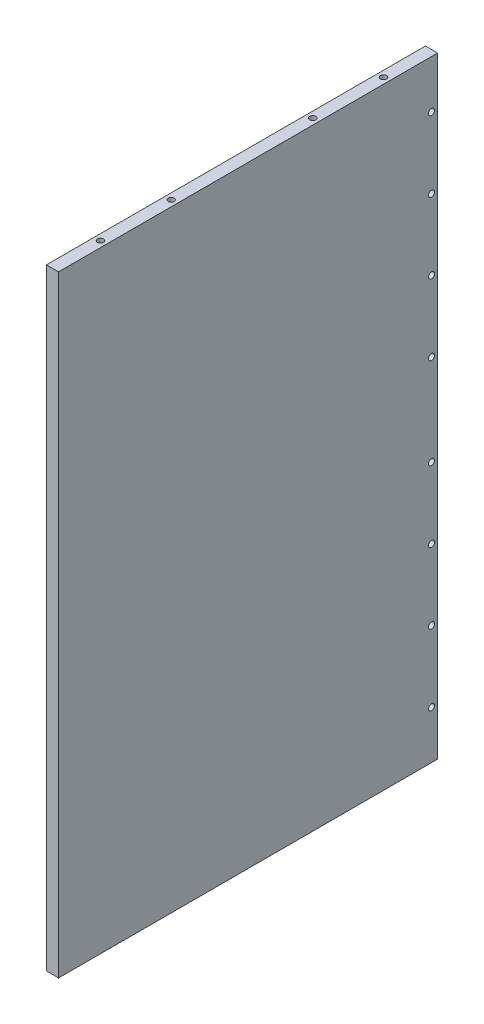
ISO-10303-21;
HEADER;
FILE_DESCRIPTION(('STEP AP214'),'2;1');
FILE_NAME('part.step','',(''),(''),'','','');
FILE_SCHEMA(('AUTOMOTIVE_DESIGN { 1 0 10303 214 1 1 1 1 }'));
ENDSEC;
DATA;
#1=APPLICATION_CONTEXT('core data for automotive mechanical design processes');
#2=APPLICATION_PROTOCOL_DEFINITION('international standard','automotive_design',2000,#1);
#3=PRODUCT_CONTEXT('',#1,'mechanical');
#4=PRODUCT('Part','Part','',(#3));
#5=PRODUCT_RELATED_PRODUCT_CATEGORY('part','',(#4));
#6=PRODUCT_DEFINITION_FORMATION('','',#4);
#7=PRODUCT_DEFINITION_CONTEXT('part definition',#1,'design');
#8=PRODUCT_DEFINITION('design','',#6,#7);
#9=PRODUCT_DEFINITION_SHAPE('','',#8);
#10=(LENGTH_UNIT() NAMED_UNIT(*) SI_UNIT(.MILLI.,.METRE.));
#11=(NAMED_UNIT(*) PLANE_ANGLE_UNIT() SI_UNIT($,.RADIAN.));
#12=(NAMED_UNIT(*) SI_UNIT($,.STERADIAN.) SOLID_ANGLE_UNIT());
#13=UNCERTAINTY_MEASURE_WITH_UNIT(LENGTH_MEASURE(1.E-05),#10,'distance_accuracy_value','');
#14=(GEOMETRIC_REPRESENTATION_CONTEXT(3) GLOBAL_UNCERTAINTY_ASSIGNED_CONTEXT((#13)) GLOBAL_UNIT_ASSIGNED_CONTEXT((#10,
#11,#12)) REPRESENTATION_CONTEXT('',''));
#15=CARTESIAN_POINT('',(0.,0.,0.));
#16=DIRECTION('',(0.,0.,1.));
#17=DIRECTION('',(1.,0.,0.));
#18=AXIS2_PLACEMENT_3D('',#15,#16,#17);
#19=CARTESIAN_POINT('',(6.,-302.5,187.5));
#20=DIRECTION('',(0.,1.,0.));
#21=DIRECTION('',(0.,0.,1.));
#22=AXIS2_PLACEMENT_3D('',#19,#20,#21);
#23=PLANE('',#22);
#24=CARTESIAN_POINT('',(7.39028153453008E-13,-302.5,70.));
#25=DIRECTION('',(0.,1.,0.));
#26=DIRECTION('',(0.,0.,-1.));
#27=AXIS2_PLACEMENT_3D('',#24,#25,#26);
#28=CIRCLE('',#27,3.);
#29=CARTESIAN_POINT('',(7.39028153453008E-13,-302.5,67.));
#30=VERTEX_POINT('',#29);
#31=EDGE_CURVE('E149',#30,#30,#28,.T.);
#32=ORIENTED_EDGE('',*,*,#31,.T.);
#33=EDGE_LOOP('',(#32));
#34=FACE_BOUND('',#33,.T.);
#35=CARTESIAN_POINT('',(0.,-302.5,-140.));
#36=DIRECTION('',(0.,1.,0.));
#37=DIRECTION('',(0.,0.,1.));
#38=AXIS2_PLACEMENT_3D('',#35,#36,#37);
#39=CIRCLE('',#38,3.);
#40=CARTESIAN_POINT('',(0.,-302.5,-137.));
#41=VERTEX_POINT('',#40);
#42=EDGE_CURVE('E137',#41,#41,#39,.T.);
#43=ORIENTED_EDGE('',*,*,#42,.T.);
#44=EDGE_LOOP('',(#43));
#45=FACE_BOUND('',#44,.T.);
#46=DIRECTION('',(0.,0.,-1.));
#47=VECTOR('',#46,1.);
#48=CARTESIAN_POINT('',(-6.,-302.5,187.5));
#49=LINE('',#48,#47);
#50=CARTESIAN_POINT('',(-6.,-302.5,187.5));
#51=VERTEX_POINT('',#50);
#52=CARTESIAN_POINT('',(-6.,-302.5,-187.5));
#53=VERTEX_POINT('',#52);
#54=EDGE_CURVE('E91',#51,#53,#49,.T.);
#55=ORIENTED_EDGE('',*,*,#54,.T.);
#56=DIRECTION('',(-1.,0.,0.));
#57=VECTOR('',#56,1.);
#58=CARTESIAN_POINT('',(6.,-302.5,-187.5));
#59=LINE('',#58,#57);
#60=CARTESIAN_POINT('',(6.,-302.5,-187.5));
#61=VERTEX_POINT('',#60);
#62=EDGE_CURVE('E44',#61,#53,#59,.T.);
#63=ORIENTED_EDGE('',*,*,#62,.F.);
#64=DIRECTION('',(0.,0.,-1.));
#65=VECTOR('',#64,1.);
#66=CARTESIAN_POINT('',(6.,-302.5,187.5));
#67=LINE('',#66,#65);
#68=CARTESIAN_POINT('',(6.,-302.5,187.5));
#69=VERTEX_POINT('',#68);
#70=EDGE_CURVE('E82',#69,#61,#67,.T.);
#71=ORIENTED_EDGE('',*,*,#70,.F.);
#72=DIRECTION('',(-1.,0.,0.));
#73=VECTOR('',#72,1.);
#74=CARTESIAN_POINT('',(6.,-302.5,187.5));
#75=LINE('',#74,#73);
#76=EDGE_CURVE('E11',#69,#51,#75,.T.);
#77=ORIENTED_EDGE('',*,*,#76,.T.);
#78=EDGE_LOOP('',(#55,#63,#71,#77));
#79=FACE_BOUND('',#78,.T.);
#80=CARTESIAN_POINT('',(7.39028153453008E-13,-302.5,-70.));
#81=DIRECTION('',(0.,1.,0.));
#82=DIRECTION('',(0.,0.,1.));
#83=AXIS2_PLACEMENT_3D('',#80,#81,#82);
#84=CIRCLE('',#83,3.);
#85=CARTESIAN_POINT('',(7.39028153453008E-13,-302.5,-67.));
#86=VERTEX_POINT('',#85);
#87=EDGE_CURVE('E143',#86,#86,#84,.T.);
#88=ORIENTED_EDGE('',*,*,#87,.T.);
#89=EDGE_LOOP('',(#88));
#90=FACE_BOUND('',#89,.T.);
#91=CARTESIAN_POINT('',(0.,-302.5,140.));
#92=DIRECTION('',(0.,1.,0.));
#93=DIRECTION('',(0.,0.,-1.));
#94=AXIS2_PLACEMENT_3D('',#91,#92,#93);
#95=CIRCLE('',#94,3.);
#96=CARTESIAN_POINT('',(0.,-302.5,137.));
#97=VERTEX_POINT('',#96);
#98=EDGE_CURVE('E155',#97,#97,#95,.T.);
#99=ORIENTED_EDGE('',*,*,#98,.T.);
#100=EDGE_LOOP('',(#99));
#101=FACE_BOUND('',#100,.T.);
#102=ADVANCED_FACE('F35',(#34,#45,#79,#90,#101),#23,.F.);
#103=CARTESIAN_POINT('',(6.,302.5,187.5));
#104=DIRECTION('',(0.,0.,-1.));
#105=DIRECTION('',(0.,1.,0.));
#106=AXIS2_PLACEMENT_3D('',#103,#104,#105);
#107=PLANE('',#106);
#108=DIRECTION('',(0.,-1.,0.));
#109=VECTOR('',#108,1.);
#110=CARTESIAN_POINT('',(-6.,302.5,187.5));
#111=LINE('',#110,#109);
#112=CARTESIAN_POINT('',(-6.,302.5,187.5));
#113=VERTEX_POINT('',#112);
#114=EDGE_CURVE('E99',#113,#51,#111,.T.);
#115=ORIENTED_EDGE('',*,*,#114,.T.);
#116=ORIENTED_EDGE('',*,*,#76,.F.);
#117=DIRECTION('',(0.,-1.,0.));
#118=VECTOR('',#117,1.);
#119=CARTESIAN_POINT('',(6.,302.5,187.5));
#120=LINE('',#119,#118);
#121=CARTESIAN_POINT('',(6.,302.5,187.5));
#122=VERTEX_POINT('',#121);
#123=EDGE_CURVE('E87',#122,#69,#120,.T.);
#124=ORIENTED_EDGE('',*,*,#123,.F.);
#125=DIRECTION('',(-1.,0.,0.));
#126=VECTOR('',#125,1.);
#127=CARTESIAN_POINT('',(6.,302.5,187.5));
#128=LINE('',#127,#126);
#129=EDGE_CURVE('E95',#122,#113,#128,.T.);
#130=ORIENTED_EDGE('',*,*,#129,.T.);
#131=EDGE_LOOP('',(#115,#116,#124,#130));
#132=FACE_BOUND('',#131,.T.);
#133=ADVANCED_FACE('F37',(#132),#107,.F.);
#134=CARTESIAN_POINT('',(6.,302.5,-187.5));
#135=DIRECTION('',(0.,0.,1.));
#136=DIRECTION('',(0.,-1.,0.));
#137=AXIS2_PLACEMENT_3D('',#134,#135,#136);
#138=PLANE('',#137);
#139=DIRECTION('',(0.,1.,0.));
#140=VECTOR('',#139,1.);
#141=CARTESIAN_POINT('',(-6.,302.5,-187.5));
#142=LINE('',#141,#140);
#143=CARTESIAN_POINT('',(-6.,302.5,-187.5));
#144=VERTEX_POINT('',#143);
#145=EDGE_CURVE('E69',#53,#144,#142,.T.);
#146=ORIENTED_EDGE('',*,*,#145,.T.);
#147=DIRECTION('',(-1.,0.,0.));
#148=VECTOR('',#147,1.);
#149=CARTESIAN_POINT('',(6.,302.5,-187.5));
#150=LINE('',#149,#148);
#151=CARTESIAN_POINT('',(6.,302.5,-187.5));
#152=VERTEX_POINT('',#151);
#153=EDGE_CURVE('E92',#152,#144,#150,.T.);
#154=ORIENTED_EDGE('',*,*,#153,.F.);
#155=DIRECTION('',(0.,1.,0.));
#156=VECTOR('',#155,1.);
#157=CARTESIAN_POINT('',(6.,302.5,-187.5));
#158=LINE('',#157,#156);
#159=EDGE_CURVE('E85',#61,#152,#158,.T.);
#160=ORIENTED_EDGE('',*,*,#159,.F.);
#161=ORIENTED_EDGE('',*,*,#62,.T.);
#162=EDGE_LOOP('',(#146,#154,#160,#161));
#163=FACE_BOUND('',#162,.T.);
#164=ADVANCED_FACE('F93',(#163),#138,.F.);
#165=CARTESIAN_POINT('',(6.,302.5,187.5));
#166=DIRECTION('',(0.,-1.,0.));
#167=DIRECTION('',(0.,0.,-1.));
#168=AXIS2_PLACEMENT_3D('',#165,#166,#167);
#169=PLANE('',#168);
#170=CARTESIAN_POINT('',(0.,302.5,140.));
#171=DIRECTION('',(0.,1.,0.));
#172=DIRECTION('',(0.,0.,-1.));
#173=AXIS2_PLACEMENT_3D('',#170,#171,#172);
#174=CIRCLE('',#173,3.);
#175=CARTESIAN_POINT('',(0.,302.5,137.));
#176=VERTEX_POINT('',#175);
#177=EDGE_CURVE('E131',#176,#176,#174,.T.);
#178=ORIENTED_EDGE('',*,*,#177,.F.);
#179=EDGE_LOOP('',(#178));
#180=FACE_BOUND('',#179,.T.);
#181=CARTESIAN_POINT('',(7.39028153453008E-13,302.5,70.));
#182=DIRECTION('',(0.,1.,0.));
#183=DIRECTION('',(0.,0.,-1.));
#184=AXIS2_PLACEMENT_3D('',#181,#182,#183);
#185=CIRCLE('',#184,3.);
#186=CARTESIAN_POINT('',(7.39028153453008E-13,302.5,67.));
#187=VERTEX_POINT('',#186);
#188=EDGE_CURVE('E125',#187,#187,#185,.T.);
#189=ORIENTED_EDGE('',*,*,#188,.F.);
#190=EDGE_LOOP('',(#189));
#191=FACE_BOUND('',#190,.T.);
#192=CARTESIAN_POINT('',(7.39028153453008E-13,302.5,-70.));
#193=DIRECTION('',(0.,1.,0.));
#194=DIRECTION('',(0.,0.,1.));
#195=AXIS2_PLACEMENT_3D('',#192,#193,#194);
#196=CIRCLE('',#195,3.);
#197=CARTESIAN_POINT('',(7.39028153453008E-13,302.5,-67.));
#198=VERTEX_POINT('',#197);
#199=EDGE_CURVE('E119',#198,#198,#196,.T.);
#200=ORIENTED_EDGE('',*,*,#199,.F.);
#201=EDGE_LOOP('',(#200));
#202=FACE_BOUND('',#201,.T.);
#203=CARTESIAN_POINT('',(0.,302.5,-140.));
#204=DIRECTION('',(0.,1.,0.));
#205=DIRECTION('',(0.,0.,1.));
#206=AXIS2_PLACEMENT_3D('',#203,#204,#205);
#207=CIRCLE('',#206,3.);
#208=CARTESIAN_POINT('',(0.,302.5,-137.));
#209=VERTEX_POINT('',#208);
#210=EDGE_CURVE('E113',#209,#209,#207,.T.);
#211=ORIENTED_EDGE('',*,*,#210,.F.);
#212=EDGE_LOOP('',(#211));
#213=FACE_BOUND('',#212,.T.);
#214=DIRECTION('',(0.,0.,1.));
#215=VECTOR('',#214,1.);
#216=CARTESIAN_POINT('',(-6.,302.5,187.5));
#217=LINE('',#216,#215);
#218=EDGE_CURVE('E75',#144,#113,#217,.T.);
#219=ORIENTED_EDGE('',*,*,#218,.T.);
#220=ORIENTED_EDGE('',*,*,#129,.F.);
#221=DIRECTION('',(0.,0.,1.));
#222=VECTOR('',#221,1.);
#223=CARTESIAN_POINT('',(6.,302.5,187.5));
#224=LINE('',#223,#222);
#225=EDGE_CURVE('E52',#152,#122,#224,.T.);
#226=ORIENTED_EDGE('',*,*,#225,.F.);
#227=ORIENTED_EDGE('',*,*,#153,.T.);
#228=EDGE_LOOP('',(#219,#220,#226,#227));
#229=FACE_BOUND('',#228,.T.);
#230=ADVANCED_FACE('F107',(#180,#191,#202,#213,#229),#169,.F.);
#231=CARTESIAN_POINT('',(6.,0.,0.));
#232=DIRECTION('',(1.,0.,0.));
#233=DIRECTION('',(0.,0.,-1.));
#234=AXIS2_PLACEMENT_3D('',#231,#232,#233);
#235=PLANE('',#234);
#236=CARTESIAN_POINT('',(6.,255.,-181.5));
#237=DIRECTION('',(1.,0.,0.));
#238=DIRECTION('',(0.,0.,1.));
#239=AXIS2_PLACEMENT_3D('',#236,#237,#238);
#240=CIRCLE('',#239,2.99999999999999);
#241=CARTESIAN_POINT('',(6.,255.,-178.5));
#242=VERTEX_POINT('',#241);
#243=EDGE_CURVE('E203',#242,#242,#240,.T.);
#244=ORIENTED_EDGE('',*,*,#243,.F.);
#245=EDGE_LOOP('',(#244));
#246=FACE_BOUND('',#245,.T.);
#247=CARTESIAN_POINT('',(6.,185.,-181.5));
#248=DIRECTION('',(1.,0.,0.));
#249=DIRECTION('',(0.,0.,1.));
#250=AXIS2_PLACEMENT_3D('',#247,#248,#249);
#251=CIRCLE('',#250,2.99999999999999);
#252=CARTESIAN_POINT('',(6.,185.,-178.5));
#253=VERTEX_POINT('',#252);
#254=EDGE_CURVE('E197',#253,#253,#251,.T.);
#255=ORIENTED_EDGE('',*,*,#254,.F.);
#256=EDGE_LOOP('',(#255));
#257=FACE_BOUND('',#256,.T.);
#258=CARTESIAN_POINT('',(6.,115.,-181.5));
#259=DIRECTION('',(1.,0.,0.));
#260=DIRECTION('',(0.,0.,1.));
#261=AXIS2_PLACEMENT_3D('',#258,#259,#260);
#262=CIRCLE('',#261,2.99999999999999);
#263=CARTESIAN_POINT('',(6.,115.,-178.5));
#264=VERTEX_POINT('',#263);
#265=EDGE_CURVE('E191',#264,#264,#262,.T.);
#266=ORIENTED_EDGE('',*,*,#265,.F.);
#267=EDGE_LOOP('',(#266));
#268=FACE_BOUND('',#267,.T.);
#269=CARTESIAN_POINT('',(6.,45.,-181.499999999999));
#270=DIRECTION('',(1.,0.,0.));
#271=DIRECTION('',(0.,0.,1.));
#272=AXIS2_PLACEMENT_3D('',#269,#270,#271);
#273=CIRCLE('',#272,2.99999999999999);
#274=CARTESIAN_POINT('',(6.,45.,-178.499999999999));
#275=VERTEX_POINT('',#274);
#276=EDGE_CURVE('E185',#275,#275,#273,.T.);
#277=ORIENTED_EDGE('',*,*,#276,.F.);
#278=EDGE_LOOP('',(#277));
#279=FACE_BOUND('',#278,.T.);
#280=CARTESIAN_POINT('',(6.,-45.0000000000001,-181.499999999999));
#281=DIRECTION('',(1.,0.,0.));
#282=DIRECTION('',(0.,0.,-1.));
#283=AXIS2_PLACEMENT_3D('',#280,#281,#282);
#284=CIRCLE('',#283,2.99999999999999);
#285=CARTESIAN_POINT('',(6.,-45.0000000000001,-184.499999999999));
#286=VERTEX_POINT('',#285);
#287=EDGE_CURVE('E179',#286,#286,#284,.T.);
#288=ORIENTED_EDGE('',*,*,#287,.F.);
#289=EDGE_LOOP('',(#288));
#290=FACE_BOUND('',#289,.T.);
#291=CARTESIAN_POINT('',(6.,-115.,-181.5));
#292=DIRECTION('',(1.,0.,0.));
#293=DIRECTION('',(0.,0.,-1.));
#294=AXIS2_PLACEMENT_3D('',#291,#292,#293);
#295=CIRCLE('',#294,2.99999999999999);
#296=CARTESIAN_POINT('',(6.,-115.,-184.5));
#297=VERTEX_POINT('',#296);
#298=EDGE_CURVE('E173',#297,#297,#295,.T.);
#299=ORIENTED_EDGE('',*,*,#298,.F.);
#300=EDGE_LOOP('',(#299));
#301=FACE_BOUND('',#300,.T.);
#302=CARTESIAN_POINT('',(6.,-185.,-181.5));
#303=DIRECTION('',(1.,0.,0.));
#304=DIRECTION('',(0.,0.,-1.));
#305=AXIS2_PLACEMENT_3D('',#302,#303,#304);
#306=CIRCLE('',#305,2.99999999999999);
#307=CARTESIAN_POINT('',(6.,-185.,-184.5));
#308=VERTEX_POINT('',#307);
#309=EDGE_CURVE('E167',#308,#308,#306,.T.);
#310=ORIENTED_EDGE('',*,*,#309,.F.);
#311=EDGE_LOOP('',(#310));
#312=FACE_BOUND('',#311,.T.);
#313=CARTESIAN_POINT('',(6.,-255.,-181.5));
#314=DIRECTION('',(1.,0.,0.));
#315=DIRECTION('',(0.,0.,-1.));
#316=AXIS2_PLACEMENT_3D('',#313,#314,#315);
#317=CIRCLE('',#316,2.99999999999999);
#318=CARTESIAN_POINT('',(6.,-255.,-184.5));
#319=VERTEX_POINT('',#318);
#320=EDGE_CURVE('E161',#319,#319,#317,.T.);
#321=ORIENTED_EDGE('',*,*,#320,.F.);
#322=EDGE_LOOP('',(#321));
#323=FACE_BOUND('',#322,.T.);
#324=ORIENTED_EDGE('',*,*,#123,.T.);
#325=ORIENTED_EDGE('',*,*,#70,.T.);
#326=ORIENTED_EDGE('',*,*,#159,.T.);
#327=ORIENTED_EDGE('',*,*,#225,.T.);
#328=EDGE_LOOP('',(#324,#325,#326,#327));
#329=FACE_BOUND('',#328,.T.);
#330=ADVANCED_FACE('F83',(#246,#257,#268,#279,#290,#301,#312,#323,#329),#235,.T.);
#331=CARTESIAN_POINT('',(-6.,0.,0.));
#332=DIRECTION('',(1.,0.,0.));
#333=DIRECTION('',(0.,0.,-1.));
#334=AXIS2_PLACEMENT_3D('',#331,#332,#333);
#335=PLANE('',#334);
#336=ORIENTED_EDGE('',*,*,#114,.F.);
#337=ORIENTED_EDGE('',*,*,#218,.F.);
#338=ORIENTED_EDGE('',*,*,#145,.F.);
#339=ORIENTED_EDGE('',*,*,#54,.F.);
#340=EDGE_LOOP('',(#336,#337,#338,#339));
#341=FACE_BOUND('',#340,.T.);
#342=ADVANCED_FACE('F110',(#341),#335,.F.);
#343=CARTESIAN_POINT('',(0.,290.5,-140.));
#344=DIRECTION('',(0.,1.,0.));
#345=DIRECTION('',(0.,0.,1.));
#346=AXIS2_PLACEMENT_3D('',#343,#344,#345);
#347=CYLINDRICAL_SURFACE('',#346,3.);
#348=CARTESIAN_POINT('',(0.,290.5,-140.));
#349=DIRECTION('',(0.,1.,0.));
#350=DIRECTION('',(0.,0.,1.));
#351=AXIS2_PLACEMENT_3D('',#348,#349,#350);
#352=CIRCLE('',#351,3.);
#353=CARTESIAN_POINT('',(0.,290.5,-137.));
#354=VERTEX_POINT('',#353);
#355=EDGE_CURVE('E102',#354,#354,#352,.T.);
#356=ORIENTED_EDGE('',*,*,#355,.F.);
#357=EDGE_LOOP('',(#356));
#358=FACE_BOUND('',#357,.T.);
#359=ORIENTED_EDGE('',*,*,#210,.T.);
#360=EDGE_LOOP('',(#359));
#361=FACE_BOUND('',#360,.T.);
#362=ADVANCED_FACE('F265',(#358,#361),#347,.F.);
#363=CARTESIAN_POINT('',(0.,290.5,-140.));
#364=DIRECTION('',(0.,1.,0.));
#365=DIRECTION('',(0.,0.,1.));
#366=AXIS2_PLACEMENT_3D('',#363,#364,#365);
#367=PLANE('',#366);
#368=ORIENTED_EDGE('',*,*,#355,.T.);
#369=EDGE_LOOP('',(#368));
#370=FACE_BOUND('',#369,.T.);
#371=ADVANCED_FACE('F269',(#370),#367,.T.);
#372=CARTESIAN_POINT('',(7.39028153453008E-13,290.5,-70.));
#373=DIRECTION('',(0.,1.,0.));
#374=DIRECTION('',(0.,0.,1.));
#375=AXIS2_PLACEMENT_3D('',#372,#373,#374);
#376=CYLINDRICAL_SURFACE('',#375,3.);
#377=CARTESIAN_POINT('',(7.39028153453008E-13,290.5,-70.));
#378=DIRECTION('',(0.,1.,0.));
#379=DIRECTION('',(0.,0.,1.));
#380=AXIS2_PLACEMENT_3D('',#377,#378,#379);
#381=CIRCLE('',#380,3.);
#382=CARTESIAN_POINT('',(7.39028153453008E-13,290.5,-67.));
#383=VERTEX_POINT('',#382);
#384=EDGE_CURVE('E116',#383,#383,#381,.T.);
#385=ORIENTED_EDGE('',*,*,#384,.F.);
#386=EDGE_LOOP('',(#385));
#387=FACE_BOUND('',#386,.T.);
#388=ORIENTED_EDGE('',*,*,#199,.T.);
#389=EDGE_LOOP('',(#388));
#390=FACE_BOUND('',#389,.T.);
#391=ADVANCED_FACE('F273',(#387,#390),#376,.F.);
#392=CARTESIAN_POINT('',(7.39028153453008E-13,290.5,-70.));
#393=DIRECTION('',(0.,1.,0.));
#394=DIRECTION('',(0.,0.,1.));
#395=AXIS2_PLACEMENT_3D('',#392,#393,#394);
#396=PLANE('',#395);
#397=ORIENTED_EDGE('',*,*,#384,.T.);
#398=EDGE_LOOP('',(#397));
#399=FACE_BOUND('',#398,.T.);
#400=ADVANCED_FACE('F277',(#399),#396,.T.);
#401=CARTESIAN_POINT('',(7.39028153453008E-13,290.5,70.));
#402=DIRECTION('',(0.,1.,0.));
#403=DIRECTION('',(0.,0.,1.));
#404=AXIS2_PLACEMENT_3D('',#401,#402,#403);
#405=CYLINDRICAL_SURFACE('',#404,3.);
#406=CARTESIAN_POINT('',(7.39028153453008E-13,290.5,70.));
#407=DIRECTION('',(0.,1.,0.));
#408=DIRECTION('',(0.,0.,-1.));
#409=AXIS2_PLACEMENT_3D('',#406,#407,#408);
#410=CIRCLE('',#409,3.);
#411=CARTESIAN_POINT('',(7.39028153453008E-13,290.5,67.));
#412=VERTEX_POINT('',#411);
#413=EDGE_CURVE('E122',#412,#412,#410,.T.);
#414=ORIENTED_EDGE('',*,*,#413,.F.);
#415=EDGE_LOOP('',(#414));
#416=FACE_BOUND('',#415,.T.);
#417=ORIENTED_EDGE('',*,*,#188,.T.);
#418=EDGE_LOOP('',(#417));
#419=FACE_BOUND('',#418,.T.);
#420=ADVANCED_FACE('F281',(#416,#419),#405,.F.);
#421=CARTESIAN_POINT('',(7.39028153453008E-13,290.5,70.));
#422=DIRECTION('',(0.,-1.,0.));
#423=DIRECTION('',(0.,0.,-1.));
#424=AXIS2_PLACEMENT_3D('',#421,#422,#423);
#425=PLANE('',#424);
#426=ORIENTED_EDGE('',*,*,#413,.T.);
#427=EDGE_LOOP('',(#426));
#428=FACE_BOUND('',#427,.T.);
#429=ADVANCED_FACE('F285',(#428),#425,.F.);
#430=CARTESIAN_POINT('',(0.,290.5,140.));
#431=DIRECTION('',(0.,1.,0.));
#432=DIRECTION('',(0.,0.,1.));
#433=AXIS2_PLACEMENT_3D('',#430,#431,#432);
#434=CYLINDRICAL_SURFACE('',#433,3.);
#435=CARTESIAN_POINT('',(0.,290.5,140.));
#436=DIRECTION('',(0.,1.,0.));
#437=DIRECTION('',(0.,0.,-1.));
#438=AXIS2_PLACEMENT_3D('',#435,#436,#437);
#439=CIRCLE('',#438,3.);
#440=CARTESIAN_POINT('',(0.,290.5,137.));
#441=VERTEX_POINT('',#440);
#442=EDGE_CURVE('E128',#441,#441,#439,.T.);
#443=ORIENTED_EDGE('',*,*,#442,.F.);
#444=EDGE_LOOP('',(#443));
#445=FACE_BOUND('',#444,.T.);
#446=ORIENTED_EDGE('',*,*,#177,.T.);
#447=EDGE_LOOP('',(#446));
#448=FACE_BOUND('',#447,.T.);
#449=ADVANCED_FACE('F289',(#445,#448),#434,.F.);
#450=CARTESIAN_POINT('',(0.,290.5,140.));
#451=DIRECTION('',(0.,-1.,0.));
#452=DIRECTION('',(0.,0.,-1.));
#453=AXIS2_PLACEMENT_3D('',#450,#451,#452);
#454=PLANE('',#453);
#455=ORIENTED_EDGE('',*,*,#442,.T.);
#456=EDGE_LOOP('',(#455));
#457=FACE_BOUND('',#456,.T.);
#458=ADVANCED_FACE('F293',(#457),#454,.F.);
#459=CARTESIAN_POINT('',(0.,-290.5,-140.));
#460=DIRECTION('',(0.,-1.,0.));
#461=DIRECTION('',(0.,0.,-1.));
#462=AXIS2_PLACEMENT_3D('',#459,#460,#461);
#463=CYLINDRICAL_SURFACE('',#462,3.);
#464=CARTESIAN_POINT('',(0.,-290.5,-140.));
#465=DIRECTION('',(0.,1.,0.));
#466=DIRECTION('',(0.,0.,1.));
#467=AXIS2_PLACEMENT_3D('',#464,#465,#466);
#468=CIRCLE('',#467,3.);
#469=CARTESIAN_POINT('',(0.,-290.5,-137.));
#470=VERTEX_POINT('',#469);
#471=EDGE_CURVE('E134',#470,#470,#468,.T.);
#472=ORIENTED_EDGE('',*,*,#471,.T.);
#473=EDGE_LOOP('',(#472));
#474=FACE_BOUND('',#473,.T.);
#475=ORIENTED_EDGE('',*,*,#42,.F.);
#476=EDGE_LOOP('',(#475));
#477=FACE_BOUND('',#476,.T.);
#478=ADVANCED_FACE('F297',(#474,#477),#463,.F.);
#479=CARTESIAN_POINT('',(0.,-290.5,-140.));
#480=DIRECTION('',(0.,-1.,0.));
#481=DIRECTION('',(0.,0.,1.));
#482=AXIS2_PLACEMENT_3D('',#479,#480,#481);
#483=PLANE('',#482);
#484=ORIENTED_EDGE('',*,*,#471,.F.);
#485=EDGE_LOOP('',(#484));
#486=FACE_BOUND('',#485,.T.);
#487=ADVANCED_FACE('F301',(#486),#483,.T.);
#488=CARTESIAN_POINT('',(7.39028153453008E-13,-290.5,-70.));
#489=DIRECTION('',(0.,-1.,0.));
#490=DIRECTION('',(0.,0.,-1.));
#491=AXIS2_PLACEMENT_3D('',#488,#489,#490);
#492=CYLINDRICAL_SURFACE('',#491,3.);
#493=CARTESIAN_POINT('',(7.39028153453008E-13,-290.5,-70.));
#494=DIRECTION('',(0.,1.,0.));
#495=DIRECTION('',(0.,0.,1.));
#496=AXIS2_PLACEMENT_3D('',#493,#494,#495);
#497=CIRCLE('',#496,3.);
#498=CARTESIAN_POINT('',(7.39028153453008E-13,-290.5,-67.));
#499=VERTEX_POINT('',#498);
#500=EDGE_CURVE('E140',#499,#499,#497,.T.);
#501=ORIENTED_EDGE('',*,*,#500,.T.);
#502=EDGE_LOOP('',(#501));
#503=FACE_BOUND('',#502,.T.);
#504=ORIENTED_EDGE('',*,*,#87,.F.);
#505=EDGE_LOOP('',(#504));
#506=FACE_BOUND('',#505,.T.);
#507=ADVANCED_FACE('F305',(#503,#506),#492,.F.);
#508=CARTESIAN_POINT('',(7.39028153453008E-13,-290.5,-70.));
#509=DIRECTION('',(0.,-1.,0.));
#510=DIRECTION('',(0.,0.,1.));
#511=AXIS2_PLACEMENT_3D('',#508,#509,#510);
#512=PLANE('',#511);
#513=ORIENTED_EDGE('',*,*,#500,.F.);
#514=EDGE_LOOP('',(#513));
#515=FACE_BOUND('',#514,.T.);
#516=ADVANCED_FACE('F309',(#515),#512,.T.);
#517=CARTESIAN_POINT('',(7.39028153453008E-13,-290.5,70.));
#518=DIRECTION('',(0.,-1.,0.));
#519=DIRECTION('',(0.,0.,-1.));
#520=AXIS2_PLACEMENT_3D('',#517,#518,#519);
#521=CYLINDRICAL_SURFACE('',#520,3.);
#522=CARTESIAN_POINT('',(7.39028153453008E-13,-290.5,70.));
#523=DIRECTION('',(0.,1.,0.));
#524=DIRECTION('',(0.,0.,-1.));
#525=AXIS2_PLACEMENT_3D('',#522,#523,#524);
#526=CIRCLE('',#525,3.);
#527=CARTESIAN_POINT('',(7.39028153453008E-13,-290.5,67.));
#528=VERTEX_POINT('',#527);
#529=EDGE_CURVE('E146',#528,#528,#526,.T.);
#530=ORIENTED_EDGE('',*,*,#529,.T.);
#531=EDGE_LOOP('',(#530));
#532=FACE_BOUND('',#531,.T.);
#533=ORIENTED_EDGE('',*,*,#31,.F.);
#534=EDGE_LOOP('',(#533));
#535=FACE_BOUND('',#534,.T.);
#536=ADVANCED_FACE('F313',(#532,#535),#521,.F.);
#537=CARTESIAN_POINT('',(7.39028153453008E-13,-290.5,70.));
#538=DIRECTION('',(0.,1.,0.));
#539=DIRECTION('',(0.,0.,-1.));
#540=AXIS2_PLACEMENT_3D('',#537,#538,#539);
#541=PLANE('',#540);
#542=ORIENTED_EDGE('',*,*,#529,.F.);
#543=EDGE_LOOP('',(#542));
#544=FACE_BOUND('',#543,.T.);
#545=ADVANCED_FACE('F317',(#544),#541,.F.);
#546=CARTESIAN_POINT('',(0.,-290.5,140.));
#547=DIRECTION('',(0.,-1.,0.));
#548=DIRECTION('',(0.,0.,-1.));
#549=AXIS2_PLACEMENT_3D('',#546,#547,#548);
#550=CYLINDRICAL_SURFACE('',#549,3.);
#551=CARTESIAN_POINT('',(0.,-290.5,140.));
#552=DIRECTION('',(0.,1.,0.));
#553=DIRECTION('',(0.,0.,-1.));
#554=AXIS2_PLACEMENT_3D('',#551,#552,#553);
#555=CIRCLE('',#554,3.);
#556=CARTESIAN_POINT('',(0.,-290.5,137.));
#557=VERTEX_POINT('',#556);
#558=EDGE_CURVE('E152',#557,#557,#555,.T.);
#559=ORIENTED_EDGE('',*,*,#558,.T.);
#560=EDGE_LOOP('',(#559));
#561=FACE_BOUND('',#560,.T.);
#562=ORIENTED_EDGE('',*,*,#98,.F.);
#563=EDGE_LOOP('',(#562));
#564=FACE_BOUND('',#563,.T.);
#565=ADVANCED_FACE('F248',(#561,#564),#550,.F.);
#566=CARTESIAN_POINT('',(0.,-290.5,140.));
#567=DIRECTION('',(0.,1.,0.));
#568=DIRECTION('',(0.,0.,-1.));
#569=AXIS2_PLACEMENT_3D('',#566,#567,#568);
#570=PLANE('',#569);
#571=ORIENTED_EDGE('',*,*,#558,.F.);
#572=EDGE_LOOP('',(#571));
#573=FACE_BOUND('',#572,.T.);
#574=ADVANCED_FACE('F238',(#573),#570,.F.);
#575=CARTESIAN_POINT('',(1.,-255.,-181.5));
#576=DIRECTION('',(1.,0.,0.));
#577=DIRECTION('',(0.,0.,-1.));
#578=AXIS2_PLACEMENT_3D('',#575,#576,#577);
#579=CYLINDRICAL_SURFACE('',#578,2.99999999999999);
#580=CARTESIAN_POINT('',(1.,-255.,-181.5));
#581=DIRECTION('',(1.,0.,0.));
#582=DIRECTION('',(0.,0.,-1.));
#583=AXIS2_PLACEMENT_3D('',#580,#581,#582);
#584=CIRCLE('',#583,2.99999999999999);
#585=CARTESIAN_POINT('',(1.,-255.,-184.5));
#586=VERTEX_POINT('',#585);
#587=EDGE_CURVE('E158',#586,#586,#584,.T.);
#588=ORIENTED_EDGE('',*,*,#587,.F.);
#589=EDGE_LOOP('',(#588));
#590=FACE_BOUND('',#589,.T.);
#591=ORIENTED_EDGE('',*,*,#320,.T.);
#592=EDGE_LOOP('',(#591));
#593=FACE_BOUND('',#592,.T.);
#594=ADVANCED_FACE('F235',(#590,#593),#579,.F.);
#595=CARTESIAN_POINT('',(1.,-255.,-181.5));
#596=DIRECTION('',(1.,0.,0.));
#597=DIRECTION('',(0.,0.,-1.));
#598=AXIS2_PLACEMENT_3D('',#595,#596,#597);
#599=PLANE('',#598);
#600=ORIENTED_EDGE('',*,*,#587,.T.);
#601=EDGE_LOOP('',(#600));
#602=FACE_BOUND('',#601,.T.);
#603=ADVANCED_FACE('F237',(#602),#599,.T.);
#604=CARTESIAN_POINT('',(1.,-185.,-181.5));
#605=DIRECTION('',(1.,0.,0.));
#606=DIRECTION('',(0.,0.,-1.));
#607=AXIS2_PLACEMENT_3D('',#604,#605,#606);
#608=CYLINDRICAL_SURFACE('',#607,2.99999999999999);
#609=CARTESIAN_POINT('',(1.,-185.,-181.5));
#610=DIRECTION('',(1.,0.,0.));
#611=DIRECTION('',(0.,0.,-1.));
#612=AXIS2_PLACEMENT_3D('',#609,#610,#611);
#613=CIRCLE('',#612,2.99999999999999);
#614=CARTESIAN_POINT('',(1.,-185.,-184.5));
#615=VERTEX_POINT('',#614);
#616=EDGE_CURVE('E164',#615,#615,#613,.T.);
#617=ORIENTED_EDGE('',*,*,#616,.F.);
#618=EDGE_LOOP('',(#617));
#619=FACE_BOUND('',#618,.T.);
#620=ORIENTED_EDGE('',*,*,#309,.T.);
#621=EDGE_LOOP('',(#620));
#622=FACE_BOUND('',#621,.T.);
#623=ADVANCED_FACE('F245',(#619,#622),#608,.F.);
#624=CARTESIAN_POINT('',(1.,-185.,-181.5));
#625=DIRECTION('',(1.,0.,0.));
#626=DIRECTION('',(0.,0.,-1.));
#627=AXIS2_PLACEMENT_3D('',#624,#625,#626);
#628=PLANE('',#627);
#629=ORIENTED_EDGE('',*,*,#616,.T.);
#630=EDGE_LOOP('',(#629));
#631=FACE_BOUND('',#630,.T.);
#632=ADVANCED_FACE('F363',(#631),#628,.T.);
#633=CARTESIAN_POINT('',(1.,-115.,-181.5));
#634=DIRECTION('',(1.,0.,0.));
#635=DIRECTION('',(0.,0.,-1.));
#636=AXIS2_PLACEMENT_3D('',#633,#634,#635);
#637=CYLINDRICAL_SURFACE('',#636,2.99999999999999);
#638=CARTESIAN_POINT('',(1.,-115.,-181.5));
#639=DIRECTION('',(1.,0.,0.));
#640=DIRECTION('',(0.,0.,-1.));
#641=AXIS2_PLACEMENT_3D('',#638,#639,#640);
#642=CIRCLE('',#641,2.99999999999999);
#643=CARTESIAN_POINT('',(1.,-115.,-184.5));
#644=VERTEX_POINT('',#643);
#645=EDGE_CURVE('E170',#644,#644,#642,.T.);
#646=ORIENTED_EDGE('',*,*,#645,.F.);
#647=EDGE_LOOP('',(#646));
#648=FACE_BOUND('',#647,.T.);
#649=ORIENTED_EDGE('',*,*,#298,.T.);
#650=EDGE_LOOP('',(#649));
#651=FACE_BOUND('',#650,.T.);
#652=ADVANCED_FACE('F373',(#648,#651),#637,.F.);
#653=CARTESIAN_POINT('',(1.,-115.,-181.5));
#654=DIRECTION('',(1.,0.,0.));
#655=DIRECTION('',(0.,0.,-1.));
#656=AXIS2_PLACEMENT_3D('',#653,#654,#655);
#657=PLANE('',#656);
#658=ORIENTED_EDGE('',*,*,#645,.T.);
#659=EDGE_LOOP('',(#658));
#660=FACE_BOUND('',#659,.T.);
#661=ADVANCED_FACE('F383',(#660),#657,.T.);
#662=CARTESIAN_POINT('',(1.,-45.0000000000001,-181.499999999999));
#663=DIRECTION('',(1.,0.,0.));
#664=DIRECTION('',(0.,0.,-1.));
#665=AXIS2_PLACEMENT_3D('',#662,#663,#664);
#666=CYLINDRICAL_SURFACE('',#665,2.99999999999999);
#667=CARTESIAN_POINT('',(1.,-45.0000000000001,-181.499999999999));
#668=DIRECTION('',(1.,0.,0.));
#669=DIRECTION('',(0.,0.,-1.));
#670=AXIS2_PLACEMENT_3D('',#667,#668,#669);
#671=CIRCLE('',#670,2.99999999999999);
#672=CARTESIAN_POINT('',(1.,-45.0000000000001,-184.499999999999));
#673=VERTEX_POINT('',#672);
#674=EDGE_CURVE('E176',#673,#673,#671,.T.);
#675=ORIENTED_EDGE('',*,*,#674,.F.);
#676=EDGE_LOOP('',(#675));
#677=FACE_BOUND('',#676,.T.);
#678=ORIENTED_EDGE('',*,*,#287,.T.);
#679=EDGE_LOOP('',(#678));
#680=FACE_BOUND('',#679,.T.);
#681=ADVANCED_FACE('F393',(#677,#680),#666,.F.);
#682=CARTESIAN_POINT('',(1.,-45.0000000000001,-181.499999999999));
#683=DIRECTION('',(1.,0.,0.));
#684=DIRECTION('',(0.,0.,-1.));
#685=AXIS2_PLACEMENT_3D('',#682,#683,#684);
#686=PLANE('',#685);
#687=ORIENTED_EDGE('',*,*,#674,.T.);
#688=EDGE_LOOP('',(#687));
#689=FACE_BOUND('',#688,.T.);
#690=ADVANCED_FACE('F403',(#689),#686,.T.);
#691=CARTESIAN_POINT('',(1.,45.,-181.499999999999));
#692=DIRECTION('',(1.,0.,0.));
#693=DIRECTION('',(0.,0.,-1.));
#694=AXIS2_PLACEMENT_3D('',#691,#692,#693);
#695=CYLINDRICAL_SURFACE('',#694,2.99999999999999);
#696=CARTESIAN_POINT('',(1.,45.,-181.499999999999));
#697=DIRECTION('',(1.,0.,0.));
#698=DIRECTION('',(0.,0.,1.));
#699=AXIS2_PLACEMENT_3D('',#696,#697,#698);
#700=CIRCLE('',#699,2.99999999999999);
#701=CARTESIAN_POINT('',(1.,45.,-178.499999999999));
#702=VERTEX_POINT('',#701);
#703=EDGE_CURVE('E182',#702,#702,#700,.T.);
#704=ORIENTED_EDGE('',*,*,#703,.F.);
#705=EDGE_LOOP('',(#704));
#706=FACE_BOUND('',#705,.T.);
#707=ORIENTED_EDGE('',*,*,#276,.T.);
#708=EDGE_LOOP('',(#707));
#709=FACE_BOUND('',#708,.T.);
#710=ADVANCED_FACE('F413',(#706,#709),#695,.F.);
#711=CARTESIAN_POINT('',(1.,45.,-181.499999999999));
#712=DIRECTION('',(-1.,0.,0.));
#713=DIRECTION('',(0.,0.,1.));
#714=AXIS2_PLACEMENT_3D('',#711,#712,#713);
#715=PLANE('',#714);
#716=ORIENTED_EDGE('',*,*,#703,.T.);
#717=EDGE_LOOP('',(#716));
#718=FACE_BOUND('',#717,.T.);
#719=ADVANCED_FACE('F423',(#718),#715,.F.);
#720=CARTESIAN_POINT('',(1.,115.,-181.5));
#721=DIRECTION('',(1.,0.,0.));
#722=DIRECTION('',(0.,0.,-1.));
#723=AXIS2_PLACEMENT_3D('',#720,#721,#722);
#724=CYLINDRICAL_SURFACE('',#723,2.99999999999999);
#725=CARTESIAN_POINT('',(1.,115.,-181.5));
#726=DIRECTION('',(1.,0.,0.));
#727=DIRECTION('',(0.,0.,1.));
#728=AXIS2_PLACEMENT_3D('',#725,#726,#727);
#729=CIRCLE('',#728,2.99999999999999);
#730=CARTESIAN_POINT('',(1.,115.,-178.5));
#731=VERTEX_POINT('',#730);
#732=EDGE_CURVE('E188',#731,#731,#729,.T.);
#733=ORIENTED_EDGE('',*,*,#732,.F.);
#734=EDGE_LOOP('',(#733));
#735=FACE_BOUND('',#734,.T.);
#736=ORIENTED_EDGE('',*,*,#265,.T.);
#737=EDGE_LOOP('',(#736));
#738=FACE_BOUND('',#737,.T.);
#739=ADVANCED_FACE('F433',(#735,#738),#724,.F.);
#740=CARTESIAN_POINT('',(1.,115.,-181.5));
#741=DIRECTION('',(-1.,0.,0.));
#742=DIRECTION('',(0.,0.,1.));
#743=AXIS2_PLACEMENT_3D('',#740,#741,#742);
#744=PLANE('',#743);
#745=ORIENTED_EDGE('',*,*,#732,.T.);
#746=EDGE_LOOP('',(#745));
#747=FACE_BOUND('',#746,.T.);
#748=ADVANCED_FACE('F443',(#747),#744,.F.);
#749=CARTESIAN_POINT('',(1.,185.,-181.5));
#750=DIRECTION('',(1.,0.,0.));
#751=DIRECTION('',(0.,0.,-1.));
#752=AXIS2_PLACEMENT_3D('',#749,#750,#751);
#753=CYLINDRICAL_SURFACE('',#752,2.99999999999999);
#754=CARTESIAN_POINT('',(1.,185.,-181.5));
#755=DIRECTION('',(1.,0.,0.));
#756=DIRECTION('',(0.,0.,1.));
#757=AXIS2_PLACEMENT_3D('',#754,#755,#756);
#758=CIRCLE('',#757,2.99999999999999);
#759=CARTESIAN_POINT('',(1.,185.,-178.5));
#760=VERTEX_POINT('',#759);
#761=EDGE_CURVE('E194',#760,#760,#758,.T.);
#762=ORIENTED_EDGE('',*,*,#761,.F.);
#763=EDGE_LOOP('',(#762));
#764=FACE_BOUND('',#763,.T.);
#765=ORIENTED_EDGE('',*,*,#254,.T.);
#766=EDGE_LOOP('',(#765));
#767=FACE_BOUND('',#766,.T.);
#768=ADVANCED_FACE('F453',(#764,#767),#753,.F.);
#769=CARTESIAN_POINT('',(1.,185.,-181.5));
#770=DIRECTION('',(-1.,0.,0.));
#771=DIRECTION('',(0.,0.,1.));
#772=AXIS2_PLACEMENT_3D('',#769,#770,#771);
#773=PLANE('',#772);
#774=ORIENTED_EDGE('',*,*,#761,.T.);
#775=EDGE_LOOP('',(#774));
#776=FACE_BOUND('',#775,.T.);
#777=ADVANCED_FACE('F214',(#776),#773,.F.);
#778=CARTESIAN_POINT('',(1.,255.,-181.5));
#779=DIRECTION('',(1.,0.,0.));
#780=DIRECTION('',(0.,0.,-1.));
#781=AXIS2_PLACEMENT_3D('',#778,#779,#780);
#782=CYLINDRICAL_SURFACE('',#781,2.99999999999999);
#783=CARTESIAN_POINT('',(1.,255.,-181.5));
#784=DIRECTION('',(1.,0.,0.));
#785=DIRECTION('',(0.,0.,1.));
#786=AXIS2_PLACEMENT_3D('',#783,#784,#785);
#787=CIRCLE('',#786,2.99999999999999);
#788=CARTESIAN_POINT('',(1.,255.,-178.5));
#789=VERTEX_POINT('',#788);
#790=EDGE_CURVE('E200',#789,#789,#787,.T.);
#791=ORIENTED_EDGE('',*,*,#790,.F.);
#792=EDGE_LOOP('',(#791));
#793=FACE_BOUND('',#792,.T.);
#794=ORIENTED_EDGE('',*,*,#243,.T.);
#795=EDGE_LOOP('',(#794));
#796=FACE_BOUND('',#795,.T.);
#797=ADVANCED_FACE('F211',(#793,#796),#782,.F.);
#798=CARTESIAN_POINT('',(1.,255.,-181.5));
#799=DIRECTION('',(-1.,0.,0.));
#800=DIRECTION('',(0.,0.,1.));
#801=AXIS2_PLACEMENT_3D('',#798,#799,#800);
#802=PLANE('',#801);
#803=ORIENTED_EDGE('',*,*,#790,.T.);
#804=EDGE_LOOP('',(#803));
#805=FACE_BOUND('',#804,.T.);
#806=ADVANCED_FACE('F209',(#805),#802,.F.);
#807=CLOSED_SHELL('',(#102,#133,#164,#230,#330,#342,#362,#371,#391,#400,#420,#429,#449,#458,
#478,#487,#507,#516,#536,#545,#565,#574,#594,#603,#623,#632,#652,#661,#681,#690,#710,#719,#739,
#748,#768,#777,#797,#806));
#808=MANIFOLD_SOLID_BREP('B2',#807);
#809=ADVANCED_BREP_SHAPE_REPRESENTATION('',(#18,#808),#14);
#810=SHAPE_DEFINITION_REPRESENTATION(#9,#809);
ENDSEC;
END-ISO-10303-21;
